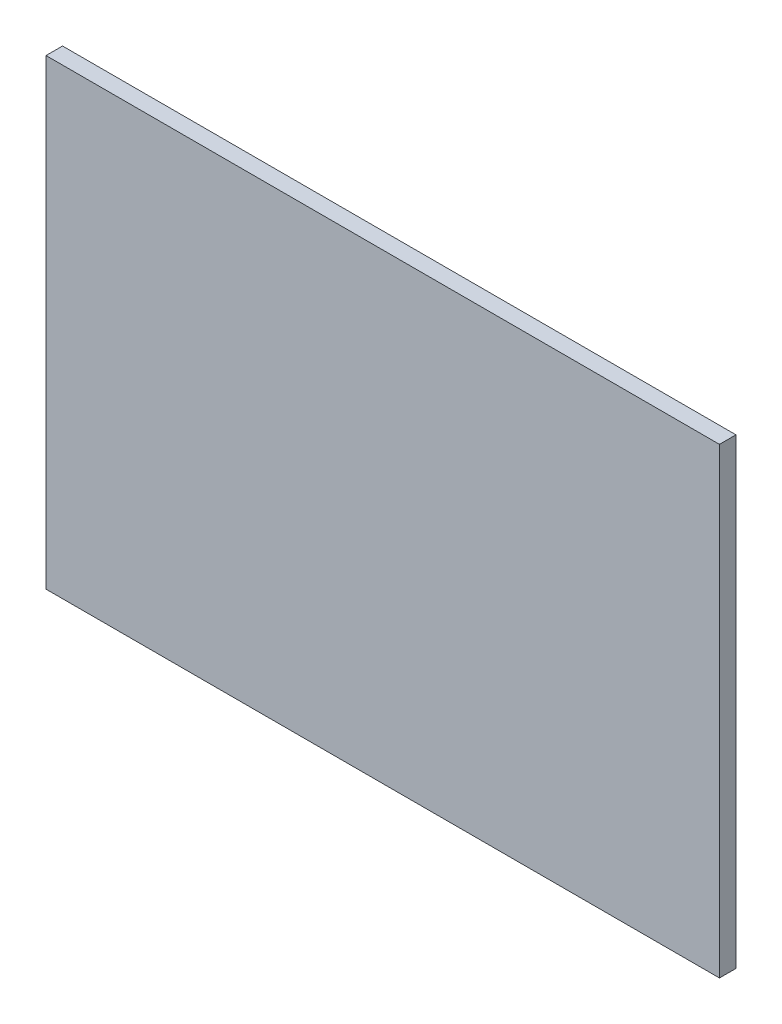
ISO-10303-21;
HEADER;
FILE_DESCRIPTION(('STEP AP214'),'2;1');
FILE_NAME('part.step','',(''),(''),'','','');
FILE_SCHEMA(('AUTOMOTIVE_DESIGN { 1 0 10303 214 1 1 1 1 }'));
ENDSEC;
DATA;
#1=APPLICATION_CONTEXT('core data for automotive mechanical design processes');
#2=APPLICATION_PROTOCOL_DEFINITION('international standard','automotive_design',2000,#1);
#3=PRODUCT_CONTEXT('',#1,'mechanical');
#4=PRODUCT('Part','Part','',(#3));
#5=PRODUCT_RELATED_PRODUCT_CATEGORY('part','',(#4));
#6=PRODUCT_DEFINITION_FORMATION('','',#4);
#7=PRODUCT_DEFINITION_CONTEXT('part definition',#1,'design');
#8=PRODUCT_DEFINITION('design','',#6,#7);
#9=PRODUCT_DEFINITION_SHAPE('','',#8);
#10=(LENGTH_UNIT() NAMED_UNIT(*) SI_UNIT(.MILLI.,.METRE.));
#11=(NAMED_UNIT(*) PLANE_ANGLE_UNIT() SI_UNIT($,.RADIAN.));
#12=(NAMED_UNIT(*) SI_UNIT($,.STERADIAN.) SOLID_ANGLE_UNIT());
#13=UNCERTAINTY_MEASURE_WITH_UNIT(LENGTH_MEASURE(1.E-05),#10,'distance_accuracy_value','');
#14=(GEOMETRIC_REPRESENTATION_CONTEXT(3) GLOBAL_UNCERTAINTY_ASSIGNED_CONTEXT((#13)) GLOBAL_UNIT_ASSIGNED_CONTEXT((#10,
#11,#12)) REPRESENTATION_CONTEXT('',''));
#15=CARTESIAN_POINT('',(0.,0.,0.));
#16=DIRECTION('',(0.,0.,1.));
#17=DIRECTION('',(1.,0.,0.));
#18=AXIS2_PLACEMENT_3D('',#15,#16,#17);
#19=CARTESIAN_POINT('',(30.6,21.,1.5));
#20=DIRECTION('',(-1.,0.,0.));
#21=DIRECTION('',(0.,-1.,0.));
#22=AXIS2_PLACEMENT_3D('',#19,#20,#21);
#23=PLANE('',#22);
#24=DIRECTION('',(0.,1.,0.));
#25=VECTOR('',#24,1.);
#26=CARTESIAN_POINT('',(30.6,21.,0.));
#27=LINE('',#26,#25);
#28=CARTESIAN_POINT('',(30.6,-21.,0.));
#29=VERTEX_POINT('',#28);
#30=CARTESIAN_POINT('',(30.6,21.,0.));
#31=VERTEX_POINT('',#30);
#32=EDGE_CURVE('E98',#29,#31,#27,.T.);
#33=ORIENTED_EDGE('',*,*,#32,.T.);
#34=DIRECTION('',(0.,0.,-1.));
#35=VECTOR('',#34,1.);
#36=CARTESIAN_POINT('',(30.6,21.,1.5));
#37=LINE('',#36,#35);
#38=CARTESIAN_POINT('',(30.6,21.,1.5));
#39=VERTEX_POINT('',#38);
#40=EDGE_CURVE('E11',#39,#31,#37,.T.);
#41=ORIENTED_EDGE('',*,*,#40,.F.);
#42=DIRECTION('',(0.,1.,0.));
#43=VECTOR('',#42,1.);
#44=CARTESIAN_POINT('',(30.6,21.,1.5));
#45=LINE('',#44,#43);
#46=CARTESIAN_POINT('',(30.6,-21.,1.5));
#47=VERTEX_POINT('',#46);
#48=EDGE_CURVE('E86',#47,#39,#45,.T.);
#49=ORIENTED_EDGE('',*,*,#48,.F.);
#50=DIRECTION('',(0.,0.,-1.));
#51=VECTOR('',#50,1.);
#52=CARTESIAN_POINT('',(30.6,-21.,1.5));
#53=LINE('',#52,#51);
#54=EDGE_CURVE('E94',#47,#29,#53,.T.);
#55=ORIENTED_EDGE('',*,*,#54,.T.);
#56=EDGE_LOOP('',(#33,#41,#49,#55));
#57=FACE_BOUND('',#56,.T.);
#58=ADVANCED_FACE('F35',(#57),#23,.F.);
#59=CARTESIAN_POINT('',(-30.6,21.,1.5));
#60=DIRECTION('',(0.,-1.,0.));
#61=DIRECTION('',(0.,0.,-1.));
#62=AXIS2_PLACEMENT_3D('',#59,#60,#61);
#63=PLANE('',#62);
#64=DIRECTION('',(-1.,0.,0.));
#65=VECTOR('',#64,1.);
#66=CARTESIAN_POINT('',(-30.6,21.,0.));
#67=LINE('',#66,#65);
#68=CARTESIAN_POINT('',(-30.6,21.,0.));
#69=VERTEX_POINT('',#68);
#70=EDGE_CURVE('E90',#31,#69,#67,.T.);
#71=ORIENTED_EDGE('',*,*,#70,.T.);
#72=DIRECTION('',(0.,0.,-1.));
#73=VECTOR('',#72,1.);
#74=CARTESIAN_POINT('',(-30.6,21.,1.5));
#75=LINE('',#74,#73);
#76=CARTESIAN_POINT('',(-30.6,21.,1.5));
#77=VERTEX_POINT('',#76);
#78=EDGE_CURVE('E43',#77,#69,#75,.T.);
#79=ORIENTED_EDGE('',*,*,#78,.F.);
#80=DIRECTION('',(-1.,0.,0.));
#81=VECTOR('',#80,1.);
#82=CARTESIAN_POINT('',(-30.6,21.,1.5));
#83=LINE('',#82,#81);
#84=EDGE_CURVE('E81',#39,#77,#83,.T.);
#85=ORIENTED_EDGE('',*,*,#84,.F.);
#86=ORIENTED_EDGE('',*,*,#40,.T.);
#87=EDGE_LOOP('',(#71,#79,#85,#86));
#88=FACE_BOUND('',#87,.T.);
#89=ADVANCED_FACE('F89',(#88),#63,.F.);
#90=CARTESIAN_POINT('',(-30.6,21.,1.5));
#91=DIRECTION('',(1.,0.,0.));
#92=DIRECTION('',(0.,1.,0.));
#93=AXIS2_PLACEMENT_3D('',#90,#91,#92);
#94=PLANE('',#93);
#95=DIRECTION('',(0.,-1.,0.));
#96=VECTOR('',#95,1.);
#97=CARTESIAN_POINT('',(-30.6,21.,0.));
#98=LINE('',#97,#96);
#99=CARTESIAN_POINT('',(-30.6,-21.,0.));
#100=VERTEX_POINT('',#99);
#101=EDGE_CURVE('E68',#69,#100,#98,.T.);
#102=ORIENTED_EDGE('',*,*,#101,.T.);
#103=DIRECTION('',(0.,0.,-1.));
#104=VECTOR('',#103,1.);
#105=CARTESIAN_POINT('',(-30.6,-21.,1.5));
#106=LINE('',#105,#104);
#107=CARTESIAN_POINT('',(-30.6,-21.,1.5));
#108=VERTEX_POINT('',#107);
#109=EDGE_CURVE('E91',#108,#100,#106,.T.);
#110=ORIENTED_EDGE('',*,*,#109,.F.);
#111=DIRECTION('',(0.,-1.,0.));
#112=VECTOR('',#111,1.);
#113=CARTESIAN_POINT('',(-30.6,21.,1.5));
#114=LINE('',#113,#112);
#115=EDGE_CURVE('E84',#77,#108,#114,.T.);
#116=ORIENTED_EDGE('',*,*,#115,.F.);
#117=ORIENTED_EDGE('',*,*,#78,.T.);
#118=EDGE_LOOP('',(#102,#110,#116,#117));
#119=FACE_BOUND('',#118,.T.);
#120=ADVANCED_FACE('F92',(#119),#94,.F.);
#121=CARTESIAN_POINT('',(-30.6,-21.,1.5));
#122=DIRECTION('',(0.,1.,0.));
#123=DIRECTION('',(0.,0.,1.));
#124=AXIS2_PLACEMENT_3D('',#121,#122,#123);
#125=PLANE('',#124);
#126=DIRECTION('',(1.,0.,0.));
#127=VECTOR('',#126,1.);
#128=CARTESIAN_POINT('',(-30.6,-21.,0.));
#129=LINE('',#128,#127);
#130=EDGE_CURVE('E74',#100,#29,#129,.T.);
#131=ORIENTED_EDGE('',*,*,#130,.T.);
#132=ORIENTED_EDGE('',*,*,#54,.F.);
#133=DIRECTION('',(1.,0.,0.));
#134=VECTOR('',#133,1.);
#135=CARTESIAN_POINT('',(-30.6,-21.,1.5));
#136=LINE('',#135,#134);
#137=EDGE_CURVE('E51',#108,#47,#136,.T.);
#138=ORIENTED_EDGE('',*,*,#137,.F.);
#139=ORIENTED_EDGE('',*,*,#109,.T.);
#140=EDGE_LOOP('',(#131,#132,#138,#139));
#141=FACE_BOUND('',#140,.T.);
#142=ADVANCED_FACE('F105',(#141),#125,.F.);
#143=CARTESIAN_POINT('',(0.,0.,1.5));
#144=DIRECTION('',(0.,0.,1.));
#145=DIRECTION('',(1.,0.,0.));
#146=AXIS2_PLACEMENT_3D('',#143,#144,#145);
#147=PLANE('',#146);
#148=ORIENTED_EDGE('',*,*,#48,.T.);
#149=ORIENTED_EDGE('',*,*,#84,.T.);
#150=ORIENTED_EDGE('',*,*,#115,.T.);
#151=ORIENTED_EDGE('',*,*,#137,.T.);
#152=EDGE_LOOP('',(#148,#149,#150,#151));
#153=FACE_BOUND('',#152,.T.);
#154=ADVANCED_FACE('F82',(#153),#147,.T.);
#155=CARTESIAN_POINT('',(0.,0.,0.));
#156=DIRECTION('',(0.,0.,1.));
#157=DIRECTION('',(1.,0.,0.));
#158=AXIS2_PLACEMENT_3D('',#155,#156,#157);
#159=PLANE('',#158);
#160=ORIENTED_EDGE('',*,*,#32,.F.);
#161=ORIENTED_EDGE('',*,*,#130,.F.);
#162=ORIENTED_EDGE('',*,*,#101,.F.);
#163=ORIENTED_EDGE('',*,*,#70,.F.);
#164=EDGE_LOOP('',(#160,#161,#162,#163));
#165=FACE_BOUND('',#164,.T.);
#166=ADVANCED_FACE('F108',(#165),#159,.F.);
#167=CLOSED_SHELL('',(#58,#89,#120,#142,#154,#166));
#168=MANIFOLD_SOLID_BREP('B2',#167);
#169=ADVANCED_BREP_SHAPE_REPRESENTATION('',(#18,#168),#14);
#170=SHAPE_DEFINITION_REPRESENTATION(#9,#169);
ENDSEC;
END-ISO-10303-21;
